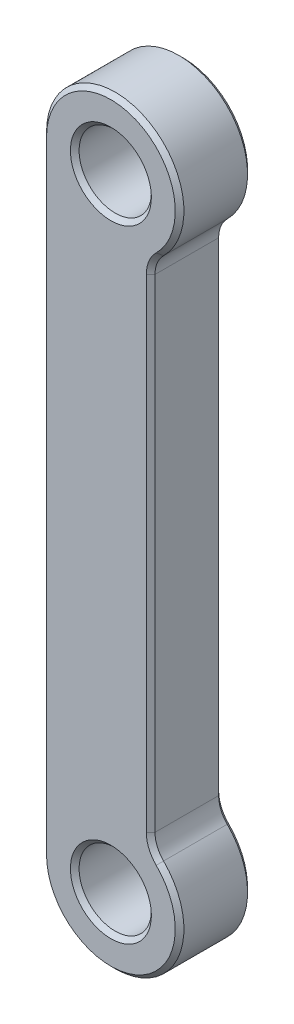
ISO-10303-21;
HEADER;
FILE_DESCRIPTION(('STEP AP214'),'2;1');
FILE_NAME('part.step','',(''),(''),'','','');
FILE_SCHEMA(('AUTOMOTIVE_DESIGN { 1 0 10303 214 1 1 1 1 }'));
ENDSEC;
DATA;
#1=APPLICATION_CONTEXT('core data for automotive mechanical design processes');
#2=APPLICATION_PROTOCOL_DEFINITION('international standard','automotive_design',2000,#1);
#3=PRODUCT_CONTEXT('',#1,'mechanical');
#4=PRODUCT('Part','Part','',(#3));
#5=PRODUCT_RELATED_PRODUCT_CATEGORY('part','',(#4));
#6=PRODUCT_DEFINITION_FORMATION('','',#4);
#7=PRODUCT_DEFINITION_CONTEXT('part definition',#1,'design');
#8=PRODUCT_DEFINITION('design','',#6,#7);
#9=PRODUCT_DEFINITION_SHAPE('','',#8);
#10=(LENGTH_UNIT() NAMED_UNIT(*) SI_UNIT(.MILLI.,.METRE.));
#11=(NAMED_UNIT(*) PLANE_ANGLE_UNIT() SI_UNIT($,.RADIAN.));
#12=(NAMED_UNIT(*) SI_UNIT($,.STERADIAN.) SOLID_ANGLE_UNIT());
#13=UNCERTAINTY_MEASURE_WITH_UNIT(LENGTH_MEASURE(1.E-05),#10,'distance_accuracy_value','');
#14=(GEOMETRIC_REPRESENTATION_CONTEXT(3) GLOBAL_UNCERTAINTY_ASSIGNED_CONTEXT((#13)) GLOBAL_UNIT_ASSIGNED_CONTEXT((#10,
#11,#12)) REPRESENTATION_CONTEXT('',''));
#15=CARTESIAN_POINT('',(0.,0.,0.));
#16=DIRECTION('',(0.,0.,1.));
#17=DIRECTION('',(1.,0.,0.));
#18=AXIS2_PLACEMENT_3D('',#15,#16,#17);
#19=CARTESIAN_POINT('',(5.75000000000001,-16.7041684766873,5.0000000000523));
#20=DIRECTION('',(0.,0.,1.));
#21=DIRECTION('',(1.,0.,0.));
#22=AXIS2_PLACEMENT_3D('',#19,#20,#21);
#23=CONICAL_SURFACE('',#22,2.29999999996879,0.785398163397448);
#24=CARTESIAN_POINT('',(5.75000000000001,-16.7041684766873,4.70000000001392));
#25=DIRECTION('',(0.,0.,1.));
#26=DIRECTION('',(1.,0.,0.));
#27=AXIS2_PLACEMENT_3D('',#24,#25,#26);
#28=CIRCLE('',#27,1.99999999993041);
#29=CARTESIAN_POINT('',(3.75000000003787,-16.7041684766873,4.70000000000696));
#30=VERTEX_POINT('',#29);
#31=CARTESIAN_POINT('',(4.34259259260149,-18.1251555946751,4.70000000002117));
#32=VERTEX_POINT('',#31);
#33=EDGE_CURVE('E87',#30,#32,#28,.T.);
#34=ORIENTED_EDGE('',*,*,#33,.F.);
#35=DIRECTION('',(0.707106781186557,0.,-0.707106781186538));
#36=VECTOR('',#35,1.);
#37=CARTESIAN_POINT('',(-498988.5,-16.7041684766262,498996.949999987));
#38=LINE('',#37,#36);
#39=CARTESIAN_POINT('',(3.45000000001533,-16.7041684766873,5.00000000005343));
#40=VERTEX_POINT('',#39);
#41=EDGE_CURVE('E92',#40,#30,#38,.T.);
#42=ORIENTED_EDGE('',*,*,#41,.F.);
#43=CARTESIAN_POINT('',(5.75000000000001,-16.7041684766873,5.0000000000523));
#44=DIRECTION('',(0.,0.,1.));
#45=DIRECTION('',(1.,0.,0.));
#46=AXIS2_PLACEMENT_3D('',#43,#44,#45);
#47=CIRCLE('',#46,2.29999999996879);
#48=CARTESIAN_POINT('',(4.13148148149628,-18.338303662365,5.0000000000523));
#49=VERTEX_POINT('',#48);
#50=EDGE_CURVE('E19',#49,#40,#47,.F.);
#51=ORIENTED_EDGE('',*,*,#50,.F.);
#52=DIRECTION('',(0.497593660834985,0.502394813564841,-0.707106781186538));
#53=VECTOR('',#52,1.);
#54=CARTESIAN_POINT('',(-351138.351851852,-354548.904776148,498996.949999987));
#55=LINE('',#54,#53);
#56=EDGE_CURVE('E73',#32,#49,#55,.F.);
#57=ORIENTED_EDGE('',*,*,#56,.F.);
#58=EDGE_LOOP('',(#34,#42,#51,#57));
#59=FACE_BOUND('',#58,.T.);
#60=ADVANCED_FACE('F16',(#59),#23,.F.);
#61=CARTESIAN_POINT('',(5.75000000000001,16.7041684766873,4.99999999999545));
#62=DIRECTION('',(0.,0.,1.));
#63=DIRECTION('',(1.,0.,0.));
#64=AXIS2_PLACEMENT_3D('',#61,#62,#63);
#65=CONICAL_SURFACE('',#64,2.30000000008249,0.785398163397448);
#66=CARTESIAN_POINT('',(5.75000000000001,16.7041684766873,4.99999999999545));
#67=DIRECTION('',(0.,0.,1.));
#68=DIRECTION('',(1.,0.,0.));
#69=AXIS2_PLACEMENT_3D('',#66,#67,#68);
#70=CIRCLE('',#69,2.30000000008249);
#71=CARTESIAN_POINT('',(3.44999999996824,16.7041684766873,5.00000000002501));
#72=VERTEX_POINT('',#71);
#73=CARTESIAN_POINT('',(4.13148148145628,18.3383036624623,4.99999999999545));
#74=VERTEX_POINT('',#73);
#75=EDGE_CURVE('E96',#72,#74,#70,.F.);
#76=ORIENTED_EDGE('',*,*,#75,.F.);
#77=DIRECTION('',(0.707106781186557,0.,-0.707106781186538));
#78=VECTOR('',#77,1.);
#79=CARTESIAN_POINT('',(-498988.5,16.7041684767484,498996.949999986));
#80=LINE('',#79,#78);
#81=CARTESIAN_POINT('',(3.74999999996681,16.7041684766873,4.69999999999275));
#82=VERTEX_POINT('',#81);
#83=EDGE_CURVE('E147',#82,#72,#80,.F.);
#84=ORIENTED_EDGE('',*,*,#83,.F.);
#85=CARTESIAN_POINT('',(5.75000000000001,16.7041684766873,4.69999999995707));
#86=DIRECTION('',(0.,0.,1.));
#87=DIRECTION('',(1.,0.,0.));
#88=AXIS2_PLACEMENT_3D('',#85,#86,#87);
#89=CIRCLE('',#88,2.0000000000441);
#90=CARTESIAN_POINT('',(4.34259259258853,18.1251555947165,4.69999999997854));
#91=VERTEX_POINT('',#90);
#92=EDGE_CURVE('E86',#91,#82,#89,.T.);
#93=ORIENTED_EDGE('',*,*,#92,.F.);
#94=DIRECTION('',(0.497593660834985,-0.502394813564841,-0.707106781186538));
#95=VECTOR('',#94,1.);
#96=CARTESIAN_POINT('',(-351138.351851852,354548.904776149,498996.949999986));
#97=LINE('',#96,#95);
#98=EDGE_CURVE('E97',#74,#91,#97,.T.);
#99=ORIENTED_EDGE('',*,*,#98,.F.);
#100=EDGE_LOOP('',(#76,#84,#93,#99));
#101=FACE_BOUND('',#100,.T.);
#102=ADVANCED_FACE('F351',(#101),#65,.F.);
#103=CARTESIAN_POINT('',(0.999999999999995,21.5,5.));
#104=DIRECTION('',(0.,0.,1.));
#105=DIRECTION('',(1.,0.,0.));
#106=AXIS2_PLACEMENT_3D('',#103,#104,#105);
#107=PLANE('',#106);
#108=CARTESIAN_POINT('',(1.,-21.5,5.00000000010914));
#109=DIRECTION('',(0.,0.,1.));
#110=DIRECTION('',(1.,0.,0.));
#111=AXIS2_PLACEMENT_3D('',#108,#109,#110);
#112=CIRCLE('',#111,2.79999999995562);
#113=CARTESIAN_POINT('',(3.79999999995562,-21.5,5.00000000010914));
#114=VERTEX_POINT('',#113);
#115=EDGE_CURVE('E109',#114,#114,#112,.F.);
#116=ORIENTED_EDGE('',*,*,#115,.T.);
#117=EDGE_LOOP('',(#116));
#118=FACE_BOUND('',#117,.T.);
#119=CARTESIAN_POINT('',(0.999999999999995,21.5,5.00000000010914));
#120=DIRECTION('',(0.,0.,1.));
#121=DIRECTION('',(1.,0.,0.));
#122=AXIS2_PLACEMENT_3D('',#119,#120,#121);
#123=CIRCLE('',#122,2.79999999995562);
#124=CARTESIAN_POINT('',(3.79999999995562,21.5,5.00000000010914));
#125=VERTEX_POINT('',#124);
#126=EDGE_CURVE('E115',#125,#125,#123,.F.);
#127=ORIENTED_EDGE('',*,*,#126,.T.);
#128=EDGE_LOOP('',(#127));
#129=FACE_BOUND('',#128,.T.);
#130=CARTESIAN_POINT('',(0.999999999999995,21.5,4.99999999999545));
#131=DIRECTION('',(0.,0.,-1.));
#132=DIRECTION('',(-1.,0.,0.));
#133=AXIS2_PLACEMENT_3D('',#130,#131,#132);
#134=CIRCLE('',#133,4.45000000004347);
#135=CARTESIAN_POINT('',(-3.45000000000227,21.5,4.99999999999773));
#136=VERTEX_POINT('',#135);
#137=EDGE_CURVE('E111',#136,#74,#134,.T.);
#138=ORIENTED_EDGE('',*,*,#137,.F.);
#139=DIRECTION('',(0.,1.,0.));
#140=VECTOR('',#139,1.);
#141=CARTESIAN_POINT('',(-3.45,21.5,5.));
#142=LINE('',#141,#140);
#143=CARTESIAN_POINT('',(-3.44999999995307,-21.5,5.0000000000523));
#144=VERTEX_POINT('',#143);
#145=EDGE_CURVE('E100',#144,#136,#142,.T.);
#146=ORIENTED_EDGE('',*,*,#145,.F.);
#147=CARTESIAN_POINT('',(1.,-21.5,5.0000000000523));
#148=DIRECTION('',(0.,0.,-1.));
#149=DIRECTION('',(-1.,0.,0.));
#150=AXIS2_PLACEMENT_3D('',#147,#148,#149);
#151=CIRCLE('',#150,4.44999999992979);
#152=EDGE_CURVE('E78',#49,#144,#151,.T.);
#153=ORIENTED_EDGE('',*,*,#152,.F.);
#154=ORIENTED_EDGE('',*,*,#50,.T.);
#155=DIRECTION('',(0.,1.,0.));
#156=VECTOR('',#155,1.);
#157=CARTESIAN_POINT('',(3.45,21.5,5.));
#158=LINE('',#157,#156);
#159=EDGE_CURVE('E101',#72,#40,#158,.F.);
#160=ORIENTED_EDGE('',*,*,#159,.F.);
#161=ORIENTED_EDGE('',*,*,#75,.T.);
#162=EDGE_LOOP('',(#138,#146,#153,#154,#160,#161));
#163=FACE_BOUND('',#162,.T.);
#164=ADVANCED_FACE('F98',(#118,#129,#163),#107,.T.);
#165=CARTESIAN_POINT('',(0.999999999999995,21.5,5.00000000010914));
#166=DIRECTION('',(0.,0.,1.));
#167=DIRECTION('',(1.,0.,0.));
#168=AXIS2_PLACEMENT_3D('',#165,#166,#167);
#169=CONICAL_SURFACE('',#168,2.79999999995562,0.785398163397448);
#170=ORIENTED_EDGE('',*,*,#126,.F.);
#171=EDGE_LOOP('',(#170));
#172=FACE_BOUND('',#171,.T.);
#173=CARTESIAN_POINT('',(0.999999999999995,21.5,4.7));
#174=DIRECTION('',(0.,0.,-1.));
#175=DIRECTION('',(-1.,0.,0.));
#176=AXIS2_PLACEMENT_3D('',#173,#174,#175);
#177=CIRCLE('',#176,2.5);
#178=CARTESIAN_POINT('',(-1.50000000000001,21.5,4.7));
#179=VERTEX_POINT('',#178);
#180=EDGE_CURVE('E143',#179,#179,#177,.T.);
#181=ORIENTED_EDGE('',*,*,#180,.T.);
#182=EDGE_LOOP('',(#181));
#183=FACE_BOUND('',#182,.T.);
#184=ADVANCED_FACE('F358',(#172,#183),#169,.F.);
#185=CARTESIAN_POINT('',(0.999999999999995,21.5,4.70000000001392));
#186=DIRECTION('',(0.,0.,-1.));
#187=DIRECTION('',(-1.,0.,0.));
#188=AXIS2_PLACEMENT_3D('',#185,#186,#187);
#189=CONICAL_SURFACE('',#188,4.74999999996816,0.785398163302709);
#190=DIRECTION('',(0.707106781186557,0.,0.707106781186538));
#191=VECTOR('',#190,1.);
#192=CARTESIAN_POINT('',(-3.45,21.5,5.));
#193=LINE('',#192,#191);
#194=CARTESIAN_POINT('',(-3.75,21.5,4.7));
#195=VERTEX_POINT('',#194);
#196=EDGE_CURVE('E114',#136,#195,#193,.F.);
#197=ORIENTED_EDGE('',*,*,#196,.F.);
#198=ORIENTED_EDGE('',*,*,#137,.T.);
#199=ORIENTED_EDGE('',*,*,#98,.T.);
#200=CARTESIAN_POINT('',(0.999999999999995,21.5,4.7));
#201=DIRECTION('',(0.,0.,-1.));
#202=DIRECTION('',(-1.,0.,0.));
#203=AXIS2_PLACEMENT_3D('',#200,#201,#202);
#204=CIRCLE('',#203,4.75);
#205=EDGE_CURVE('E130',#195,#91,#204,.T.);
#206=ORIENTED_EDGE('',*,*,#205,.F.);
#207=EDGE_LOOP('',(#197,#198,#199,#206));
#208=FACE_BOUND('',#207,.T.);
#209=ADVANCED_FACE('F124',(#208),#189,.T.);
#210=CARTESIAN_POINT('',(-3.45,21.5,5.));
#211=DIRECTION('',(-0.707106781186538,0.,0.707106781186557));
#212=DIRECTION('',(0.707106781186557,0.,0.707106781186538));
#213=AXIS2_PLACEMENT_3D('',#210,#211,#212);
#214=PLANE('',#213);
#215=DIRECTION('',(0.707106781186557,0.,0.707106781186538));
#216=VECTOR('',#215,1.);
#217=CARTESIAN_POINT('',(-499000.,-21.5,-498991.549999987));
#218=LINE('',#217,#216);
#219=CARTESIAN_POINT('',(-3.74999999997783,-21.5,4.70000000001769));
#220=VERTEX_POINT('',#219);
#221=EDGE_CURVE('E102',#144,#220,#218,.F.);
#222=ORIENTED_EDGE('',*,*,#221,.F.);
#223=ORIENTED_EDGE('',*,*,#145,.T.);
#224=ORIENTED_EDGE('',*,*,#196,.T.);
#225=DIRECTION('',(0.,1.,0.));
#226=VECTOR('',#225,1.);
#227=CARTESIAN_POINT('',(-3.75,21.5,4.7));
#228=LINE('',#227,#226);
#229=EDGE_CURVE('E240',#195,#220,#228,.F.);
#230=ORIENTED_EDGE('',*,*,#229,.T.);
#231=EDGE_LOOP('',(#222,#223,#224,#230));
#232=FACE_BOUND('',#231,.T.);
#233=ADVANCED_FACE('F419',(#232),#214,.T.);
#234=CARTESIAN_POINT('',(1.,-21.5,4.70000000007076));
#235=DIRECTION('',(0.,0.,-1.));
#236=DIRECTION('',(-1.,0.,0.));
#237=AXIS2_PLACEMENT_3D('',#234,#235,#236);
#238=CONICAL_SURFACE('',#237,4.74999999991132,0.785398163397448);
#239=ORIENTED_EDGE('',*,*,#56,.T.);
#240=ORIENTED_EDGE('',*,*,#152,.T.);
#241=ORIENTED_EDGE('',*,*,#221,.T.);
#242=CARTESIAN_POINT('',(1.,-21.5,4.7));
#243=DIRECTION('',(0.,0.,-1.));
#244=DIRECTION('',(-1.,0.,0.));
#245=AXIS2_PLACEMENT_3D('',#242,#243,#244);
#246=CIRCLE('',#245,4.75);
#247=EDGE_CURVE('E82',#32,#220,#246,.T.);
#248=ORIENTED_EDGE('',*,*,#247,.F.);
#249=EDGE_LOOP('',(#239,#240,#241,#248));
#250=FACE_BOUND('',#249,.T.);
#251=ADVANCED_FACE('F75',(#250),#238,.T.);
#252=CARTESIAN_POINT('',(3.45,21.5,5.));
#253=DIRECTION('',(0.707106781186538,0.,0.707106781186557));
#254=DIRECTION('',(0.707106781186557,0.,-0.707106781186538));
#255=AXIS2_PLACEMENT_3D('',#252,#253,#254);
#256=PLANE('',#255);
#257=ORIENTED_EDGE('',*,*,#41,.T.);
#258=DIRECTION('',(0.,-1.,0.));
#259=VECTOR('',#258,1.);
#260=CARTESIAN_POINT('',(3.75000000000001,16.7041684766873,4.7));
#261=LINE('',#260,#259);
#262=EDGE_CURVE('E208',#30,#82,#261,.F.);
#263=ORIENTED_EDGE('',*,*,#262,.T.);
#264=ORIENTED_EDGE('',*,*,#83,.T.);
#265=ORIENTED_EDGE('',*,*,#159,.T.);
#266=EDGE_LOOP('',(#257,#263,#264,#265));
#267=FACE_BOUND('',#266,.T.);
#268=ADVANCED_FACE('F350',(#267),#256,.T.);
#269=CARTESIAN_POINT('',(5.75000000000001,16.7041684766873,5.));
#270=DIRECTION('',(0.,0.,-1.));
#271=DIRECTION('',(-1.,0.,0.));
#272=AXIS2_PLACEMENT_3D('',#269,#270,#271);
#273=CYLINDRICAL_SURFACE('',#272,2.);
#274=CARTESIAN_POINT('',(5.75000000000001,16.7041684766873,0.300000000000002));
#275=DIRECTION('',(0.,0.,-1.));
#276=DIRECTION('',(-1.,0.,0.));
#277=AXIS2_PLACEMENT_3D('',#274,#275,#276);
#278=CIRCLE('',#277,2.);
#279=CARTESIAN_POINT('',(4.34259259257847,18.1251555947189,0.299999999976559));
#280=VERTEX_POINT('',#279);
#281=CARTESIAN_POINT('',(3.75000000000626,16.7041684766873,0.299999999981175));
#282=VERTEX_POINT('',#281);
#283=EDGE_CURVE('E104',#280,#282,#278,.F.);
#284=ORIENTED_EDGE('',*,*,#283,.F.);
#285=DIRECTION('',(0.,0.,-1.));
#286=VECTOR('',#285,1.);
#287=CARTESIAN_POINT('',(4.3425925925926,18.1251555947059,5.));
#288=LINE('',#287,#286);
#289=EDGE_CURVE('E145',#91,#280,#288,.T.);
#290=ORIENTED_EDGE('',*,*,#289,.F.);
#291=ORIENTED_EDGE('',*,*,#92,.T.);
#292=DIRECTION('',(0.,0.,1.));
#293=VECTOR('',#292,1.);
#294=CARTESIAN_POINT('',(3.75000000000001,16.7041684766873,5.));
#295=LINE('',#294,#293);
#296=EDGE_CURVE('E203',#82,#282,#295,.F.);
#297=ORIENTED_EDGE('',*,*,#296,.T.);
#298=EDGE_LOOP('',(#284,#290,#291,#297));
#299=FACE_BOUND('',#298,.T.);
#300=ADVANCED_FACE('F411',(#299),#273,.F.);
#301=CARTESIAN_POINT('',(5.75000000000001,-16.7041684766873,5.));
#302=DIRECTION('',(0.,0.,-1.));
#303=DIRECTION('',(-1.,0.,0.));
#304=AXIS2_PLACEMENT_3D('',#301,#302,#303);
#305=CYLINDRICAL_SURFACE('',#304,2.);
#306=CARTESIAN_POINT('',(5.75000000000001,-16.7041684766873,0.300000000000002));
#307=DIRECTION('',(0.,0.,-1.));
#308=DIRECTION('',(-1.,0.,0.));
#309=AXIS2_PLACEMENT_3D('',#306,#307,#308);
#310=CIRCLE('',#309,2.);
#311=CARTESIAN_POINT('',(3.75000000000001,-16.7041684766873,0.300000000000002));
#312=VERTEX_POINT('',#311);
#313=CARTESIAN_POINT('',(4.34259259258328,-18.1251555947461,0.299999999976559));
#314=VERTEX_POINT('',#313);
#315=EDGE_CURVE('E251',#312,#314,#310,.F.);
#316=ORIENTED_EDGE('',*,*,#315,.F.);
#317=DIRECTION('',(0.,0.,1.));
#318=VECTOR('',#317,1.);
#319=CARTESIAN_POINT('',(3.75000000000001,-16.7041684766873,5.));
#320=LINE('',#319,#318);
#321=EDGE_CURVE('E199',#312,#30,#320,.T.);
#322=ORIENTED_EDGE('',*,*,#321,.T.);
#323=ORIENTED_EDGE('',*,*,#33,.T.);
#324=DIRECTION('',(0.,0.,-1.));
#325=VECTOR('',#324,1.);
#326=CARTESIAN_POINT('',(4.3425925925926,-18.1251555947059,5.));
#327=LINE('',#326,#325);
#328=EDGE_CURVE('E217',#314,#32,#327,.F.);
#329=ORIENTED_EDGE('',*,*,#328,.F.);
#330=EDGE_LOOP('',(#316,#322,#323,#329));
#331=FACE_BOUND('',#330,.T.);
#332=ADVANCED_FACE('F344',(#331),#305,.F.);
#333=CARTESIAN_POINT('',(1.,-21.5,5.00000000010914));
#334=DIRECTION('',(0.,0.,1.));
#335=DIRECTION('',(1.,0.,0.));
#336=AXIS2_PLACEMENT_3D('',#333,#334,#335);
#337=CONICAL_SURFACE('',#336,2.79999999995562,0.785398163397448);
#338=ORIENTED_EDGE('',*,*,#115,.F.);
#339=EDGE_LOOP('',(#338));
#340=FACE_BOUND('',#339,.T.);
#341=CARTESIAN_POINT('',(1.,-21.5,4.7));
#342=DIRECTION('',(0.,0.,-1.));
#343=DIRECTION('',(-1.,0.,0.));
#344=AXIS2_PLACEMENT_3D('',#341,#342,#343);
#345=CIRCLE('',#344,2.5);
#346=CARTESIAN_POINT('',(-1.5,-21.5,4.7));
#347=VERTEX_POINT('',#346);
#348=EDGE_CURVE('E202',#347,#347,#345,.T.);
#349=ORIENTED_EDGE('',*,*,#348,.T.);
#350=EDGE_LOOP('',(#349));
#351=FACE_BOUND('',#350,.T.);
#352=ADVANCED_FACE('F404',(#340,#351),#337,.F.);
#353=CARTESIAN_POINT('',(0.999999999999995,21.5,5.));
#354=DIRECTION('',(0.,0.,-1.));
#355=DIRECTION('',(-1.,0.,0.));
#356=AXIS2_PLACEMENT_3D('',#353,#354,#355);
#357=CYLINDRICAL_SURFACE('',#356,2.5);
#358=CARTESIAN_POINT('',(0.999999999999995,21.5,0.299999999981537));
#359=DIRECTION('',(0.,0.,-1.));
#360=DIRECTION('',(-1.,0.,0.));
#361=AXIS2_PLACEMENT_3D('',#358,#359,#360);
#362=CIRCLE('',#361,2.50000000002137);
#363=CARTESIAN_POINT('',(-1.50000000002137,21.5,0.299999999981537));
#364=VERTEX_POINT('',#363);
#365=EDGE_CURVE('E236',#364,#364,#362,.T.);
#366=ORIENTED_EDGE('',*,*,#365,.T.);
#367=EDGE_LOOP('',(#366));
#368=FACE_BOUND('',#367,.T.);
#369=ORIENTED_EDGE('',*,*,#180,.F.);
#370=EDGE_LOOP('',(#369));
#371=FACE_BOUND('',#370,.T.);
#372=ADVANCED_FACE('F401',(#368,#371),#357,.F.);
#373=CARTESIAN_POINT('',(0.999999999999995,21.5,5.));
#374=DIRECTION('',(0.,0.,-1.));
#375=DIRECTION('',(-1.,0.,0.));
#376=AXIS2_PLACEMENT_3D('',#373,#374,#375);
#377=CYLINDRICAL_SURFACE('',#376,4.75);
#378=DIRECTION('',(0.,0.,-1.));
#379=VECTOR('',#378,1.);
#380=CARTESIAN_POINT('',(-3.75,21.5,5.));
#381=LINE('',#380,#379);
#382=CARTESIAN_POINT('',(-3.74999999998022,21.5,0.299999999995386));
#383=VERTEX_POINT('',#382);
#384=EDGE_CURVE('E231',#383,#195,#381,.F.);
#385=ORIENTED_EDGE('',*,*,#384,.T.);
#386=ORIENTED_EDGE('',*,*,#205,.T.);
#387=ORIENTED_EDGE('',*,*,#289,.T.);
#388=CARTESIAN_POINT('',(0.999999999999995,21.5,0.299999999981537));
#389=DIRECTION('',(0.,0.,1.));
#390=DIRECTION('',(1.,0.,0.));
#391=AXIS2_PLACEMENT_3D('',#388,#389,#390);
#392=CIRCLE('',#391,4.74999999992088);
#393=EDGE_CURVE('E226',#383,#280,#392,.F.);
#394=ORIENTED_EDGE('',*,*,#393,.F.);
#395=EDGE_LOOP('',(#385,#386,#387,#394));
#396=FACE_BOUND('',#395,.T.);
#397=ADVANCED_FACE('F271',(#396),#377,.T.);
#398=CARTESIAN_POINT('',(-3.75,21.5,5.));
#399=DIRECTION('',(1.,0.,0.));
#400=DIRECTION('',(0.,0.,-1.));
#401=AXIS2_PLACEMENT_3D('',#398,#399,#400);
#402=PLANE('',#401);
#403=DIRECTION('',(0.,1.,0.));
#404=VECTOR('',#403,1.);
#405=CARTESIAN_POINT('',(-3.75,21.5,0.300000000000002));
#406=LINE('',#405,#404);
#407=CARTESIAN_POINT('',(-3.74999999997226,-21.5,0.299999999962348));
#408=VERTEX_POINT('',#407);
#409=EDGE_CURVE('E222',#383,#408,#406,.F.);
#410=ORIENTED_EDGE('',*,*,#409,.T.);
#411=DIRECTION('',(0.,0.,-1.));
#412=VECTOR('',#411,1.);
#413=CARTESIAN_POINT('',(-3.75,-21.5,5.));
#414=LINE('',#413,#412);
#415=EDGE_CURVE('E219',#220,#408,#414,.T.);
#416=ORIENTED_EDGE('',*,*,#415,.F.);
#417=ORIENTED_EDGE('',*,*,#229,.F.);
#418=ORIENTED_EDGE('',*,*,#384,.F.);
#419=EDGE_LOOP('',(#410,#416,#417,#418));
#420=FACE_BOUND('',#419,.T.);
#421=ADVANCED_FACE('F306',(#420),#402,.F.);
#422=CARTESIAN_POINT('',(1.,-21.5,5.));
#423=DIRECTION('',(0.,0.,-1.));
#424=DIRECTION('',(-1.,0.,0.));
#425=AXIS2_PLACEMENT_3D('',#422,#423,#424);
#426=CYLINDRICAL_SURFACE('',#425,4.75);
#427=ORIENTED_EDGE('',*,*,#328,.T.);
#428=ORIENTED_EDGE('',*,*,#247,.T.);
#429=ORIENTED_EDGE('',*,*,#415,.T.);
#430=CARTESIAN_POINT('',(1.,-21.5,0.299999999981537));
#431=DIRECTION('',(0.,0.,1.));
#432=DIRECTION('',(1.,0.,0.));
#433=AXIS2_PLACEMENT_3D('',#430,#431,#432);
#434=CIRCLE('',#433,4.74999999997772);
#435=EDGE_CURVE('E211',#314,#408,#434,.F.);
#436=ORIENTED_EDGE('',*,*,#435,.F.);
#437=EDGE_LOOP('',(#427,#428,#429,#436));
#438=FACE_BOUND('',#437,.T.);
#439=ADVANCED_FACE('F303',(#438),#426,.T.);
#440=CARTESIAN_POINT('',(3.75000000000001,16.7041684766873,5.));
#441=DIRECTION('',(-1.,0.,0.));
#442=DIRECTION('',(0.,-1.,0.));
#443=AXIS2_PLACEMENT_3D('',#440,#441,#442);
#444=PLANE('',#443);
#445=DIRECTION('',(0.,1.,0.));
#446=VECTOR('',#445,1.);
#447=CARTESIAN_POINT('',(3.75000000000001,16.7041684766873,0.300000000000004));
#448=LINE('',#447,#446);
#449=EDGE_CURVE('E192',#312,#282,#448,.T.);
#450=ORIENTED_EDGE('',*,*,#449,.T.);
#451=ORIENTED_EDGE('',*,*,#296,.F.);
#452=ORIENTED_EDGE('',*,*,#262,.F.);
#453=ORIENTED_EDGE('',*,*,#321,.F.);
#454=EDGE_LOOP('',(#450,#451,#452,#453));
#455=FACE_BOUND('',#454,.T.);
#456=ADVANCED_FACE('F348',(#455),#444,.F.);
#457=CARTESIAN_POINT('',(1.,-21.5,5.));
#458=DIRECTION('',(0.,0.,-1.));
#459=DIRECTION('',(-1.,0.,0.));
#460=AXIS2_PLACEMENT_3D('',#457,#458,#459);
#461=CYLINDRICAL_SURFACE('',#460,2.5);
#462=CARTESIAN_POINT('',(1.,-21.5,0.299999999981537));
#463=DIRECTION('',(0.,0.,-1.));
#464=DIRECTION('',(-1.,0.,0.));
#465=AXIS2_PLACEMENT_3D('',#462,#463,#464);
#466=CIRCLE('',#465,2.50000000002137);
#467=CARTESIAN_POINT('',(-1.50000000002137,-21.5,0.299999999981537));
#468=VERTEX_POINT('',#467);
#469=EDGE_CURVE('E178',#468,#468,#466,.T.);
#470=ORIENTED_EDGE('',*,*,#469,.T.);
#471=EDGE_LOOP('',(#470));
#472=FACE_BOUND('',#471,.T.);
#473=ORIENTED_EDGE('',*,*,#348,.F.);
#474=EDGE_LOOP('',(#473));
#475=FACE_BOUND('',#474,.T.);
#476=ADVANCED_FACE('F390',(#472,#475),#461,.F.);
#477=CARTESIAN_POINT('',(0.999999999999995,21.5,0.));
#478=DIRECTION('',(0.,0.,-1.));
#479=DIRECTION('',(-1.,0.,0.));
#480=AXIS2_PLACEMENT_3D('',#477,#478,#479);
#481=CONICAL_SURFACE('',#480,2.80000000000291,0.785398163397448);
#482=CARTESIAN_POINT('',(0.999999999999995,21.5,0.));
#483=DIRECTION('',(0.,0.,-1.));
#484=DIRECTION('',(-1.,0.,0.));
#485=AXIS2_PLACEMENT_3D('',#482,#483,#484);
#486=CIRCLE('',#485,2.80000000000291);
#487=CARTESIAN_POINT('',(-1.80000000000291,21.5,0.));
#488=VERTEX_POINT('',#487);
#489=EDGE_CURVE('E176',#488,#488,#486,.T.);
#490=ORIENTED_EDGE('',*,*,#489,.T.);
#491=EDGE_LOOP('',(#490));
#492=FACE_BOUND('',#491,.T.);
#493=ORIENTED_EDGE('',*,*,#365,.F.);
#494=EDGE_LOOP('',(#493));
#495=FACE_BOUND('',#494,.T.);
#496=ADVANCED_FACE('F386',(#492,#495),#481,.F.);
#497=CARTESIAN_POINT('',(0.999999999999995,21.5,0.299999999924694));
#498=DIRECTION('',(0.,0.,1.));
#499=DIRECTION('',(1.,0.,0.));
#500=AXIS2_PLACEMENT_3D('',#497,#498,#499);
#501=CONICAL_SURFACE('',#500,4.74999999986404,0.785398163397448);
#502=DIRECTION('',(0.707106781186548,0.,-0.707106781186548));
#503=VECTOR('',#502,1.);
#504=CARTESIAN_POINT('',(-3.75,21.5,0.300000000000002));
#505=LINE('',#504,#503);
#506=CARTESIAN_POINT('',(-3.45,21.5,0.));
#507=VERTEX_POINT('',#506);
#508=EDGE_CURVE('E225',#507,#383,#505,.F.);
#509=ORIENTED_EDGE('',*,*,#508,.T.);
#510=ORIENTED_EDGE('',*,*,#393,.T.);
#511=DIRECTION('',(0.497593660834978,-0.502394813564835,0.707106781186548));
#512=VECTOR('',#511,1.);
#513=CARTESIAN_POINT('',(-351144.016666666,354554.624249299,-499000.));
#514=LINE('',#513,#512);
#515=CARTESIAN_POINT('',(4.13148148149238,18.3383036624261,-4.71589845361186E-11));
#516=VERTEX_POINT('',#515);
#517=EDGE_CURVE('E182',#280,#516,#514,.F.);
#518=ORIENTED_EDGE('',*,*,#517,.T.);
#519=CARTESIAN_POINT('',(0.999999999999995,21.5,0.));
#520=DIRECTION('',(0.,0.,1.));
#521=DIRECTION('',(1.,0.,0.));
#522=AXIS2_PLACEMENT_3D('',#519,#520,#521);
#523=CIRCLE('',#522,4.44999999993934);
#524=EDGE_CURVE('E175',#516,#507,#523,.T.);
#525=ORIENTED_EDGE('',*,*,#524,.T.);
#526=EDGE_LOOP('',(#509,#510,#518,#525));
#527=FACE_BOUND('',#526,.T.);
#528=ADVANCED_FACE('F383',(#527),#501,.T.);
#529=CARTESIAN_POINT('',(-3.75,21.5,0.300000000000002));
#530=DIRECTION('',(0.707106781186548,0.,0.707106781186548));
#531=DIRECTION('',(0.707106781186548,0.,-0.707106781186548));
#532=AXIS2_PLACEMENT_3D('',#529,#530,#531);
#533=PLANE('',#532);
#534=DIRECTION('',(0.,1.,0.));
#535=VECTOR('',#534,1.);
#536=CARTESIAN_POINT('',(-3.45,21.5,0.));
#537=LINE('',#536,#535);
#538=CARTESIAN_POINT('',(-3.44999999999236,-21.5,-2.8421709430404E-11));
#539=VERTEX_POINT('',#538);
#540=EDGE_CURVE('E174',#507,#539,#537,.F.);
#541=ORIENTED_EDGE('',*,*,#540,.T.);
#542=DIRECTION('',(0.707106781186547,0.,-0.707106781186548));
#543=VECTOR('',#542,1.);
#544=CARTESIAN_POINT('',(-498998.,-21.4999999999389,498994.55));
#545=LINE('',#544,#543);
#546=EDGE_CURVE('E214',#408,#539,#545,.T.);
#547=ORIENTED_EDGE('',*,*,#546,.F.);
#548=ORIENTED_EDGE('',*,*,#409,.F.);
#549=ORIENTED_EDGE('',*,*,#508,.F.);
#550=EDGE_LOOP('',(#541,#547,#548,#549));
#551=FACE_BOUND('',#550,.T.);
#552=ADVANCED_FACE('F310',(#551),#533,.F.);
#553=CARTESIAN_POINT('',(1.,-21.5,0.29999999986785));
#554=DIRECTION('',(0.,0.,1.));
#555=DIRECTION('',(1.,0.,0.));
#556=AXIS2_PLACEMENT_3D('',#553,#554,#555);
#557=CONICAL_SURFACE('',#556,4.74999999992087,0.785398163397448);
#558=DIRECTION('',(0.497593660834979,0.502394813564833,0.707106781186549));
#559=VECTOR('',#558,1.);
#560=CARTESIAN_POINT('',(-351144.016666667,-354554.624249297,-499000.));
#561=LINE('',#560,#559);
#562=CARTESIAN_POINT('',(4.13148148151686,-18.3383036624348,-2.8421709430404E-11));
#563=VERTEX_POINT('',#562);
#564=EDGE_CURVE('E196',#563,#314,#561,.T.);
#565=ORIENTED_EDGE('',*,*,#564,.T.);
#566=ORIENTED_EDGE('',*,*,#435,.T.);
#567=ORIENTED_EDGE('',*,*,#546,.T.);
#568=CARTESIAN_POINT('',(1.,-21.5,0.));
#569=DIRECTION('',(0.,0.,1.));
#570=DIRECTION('',(1.,0.,0.));
#571=AXIS2_PLACEMENT_3D('',#568,#569,#570);
#572=CIRCLE('',#571,4.45000000005302);
#573=EDGE_CURVE('E172',#539,#563,#572,.T.);
#574=ORIENTED_EDGE('',*,*,#573,.T.);
#575=EDGE_LOOP('',(#565,#566,#567,#574));
#576=FACE_BOUND('',#575,.T.);
#577=ADVANCED_FACE('F297',(#576),#557,.T.);
#578=CARTESIAN_POINT('',(5.75000000000001,-16.7041684766873,-5.6843418860808E-11));
#579=DIRECTION('',(0.,0.,-1.));
#580=DIRECTION('',(-1.,0.,0.));
#581=AXIS2_PLACEMENT_3D('',#578,#579,#580);
#582=CONICAL_SURFACE('',#581,2.30000000001338,0.785398163397448);
#583=CARTESIAN_POINT('',(5.75000000000001,-16.7041684766873,-5.6843418860808E-11));
#584=DIRECTION('',(0.,0.,-1.));
#585=DIRECTION('',(-1.,0.,0.));
#586=AXIS2_PLACEMENT_3D('',#583,#584,#585);
#587=CIRCLE('',#586,2.30000000001338);
#588=CARTESIAN_POINT('',(3.44999999997159,-16.7041684766873,-2.84216145627139E-11));
#589=VERTEX_POINT('',#588);
#590=EDGE_CURVE('E169',#563,#589,#587,.T.);
#591=ORIENTED_EDGE('',*,*,#590,.T.);
#592=DIRECTION('',(0.707106781186547,0.,0.707106781186548));
#593=VECTOR('',#592,1.);
#594=CARTESIAN_POINT('',(3.75000000000001,-16.7041684766873,0.3));
#595=LINE('',#594,#593);
#596=EDGE_CURVE('E195',#589,#312,#595,.T.);
#597=ORIENTED_EDGE('',*,*,#596,.T.);
#598=ORIENTED_EDGE('',*,*,#315,.T.);
#599=ORIENTED_EDGE('',*,*,#564,.F.);
#600=EDGE_LOOP('',(#591,#597,#598,#599));
#601=FACE_BOUND('',#600,.T.);
#602=ADVANCED_FACE('F340',(#601),#582,.F.);
#603=CARTESIAN_POINT('',(3.75000000000001,16.7041684766873,0.300000000000002));
#604=DIRECTION('',(-0.707106781186548,0.,0.707106781186547));
#605=DIRECTION('',(0.707106781186547,0.,0.707106781186548));
#606=AXIS2_PLACEMENT_3D('',#603,#604,#605);
#607=PLANE('',#606);
#608=DIRECTION('',(0.,1.,0.));
#609=VECTOR('',#608,1.);
#610=CARTESIAN_POINT('',(3.45000000000001,21.5,0.));
#611=LINE('',#610,#609);
#612=CARTESIAN_POINT('',(3.45000000002954,16.7041684766873,-5.6843418860808E-11));
#613=VERTEX_POINT('',#612);
#614=EDGE_CURVE('E168',#589,#613,#611,.T.);
#615=ORIENTED_EDGE('',*,*,#614,.T.);
#616=DIRECTION('',(0.707106781186547,0.,0.707106781186548));
#617=VECTOR('',#616,1.);
#618=CARTESIAN_POINT('',(-498996.55,16.7041684766873,-499000.));
#619=LINE('',#618,#617);
#620=EDGE_CURVE('E34',#613,#282,#619,.T.);
#621=ORIENTED_EDGE('',*,*,#620,.T.);
#622=ORIENTED_EDGE('',*,*,#449,.F.);
#623=ORIENTED_EDGE('',*,*,#596,.F.);
#624=EDGE_LOOP('',(#615,#621,#622,#623));
#625=FACE_BOUND('',#624,.T.);
#626=ADVANCED_FACE('F333',(#625),#607,.F.);
#627=CARTESIAN_POINT('',(5.75000000000001,16.7041684766873,-5.6843418860808E-11));
#628=DIRECTION('',(0.,0.,-1.));
#629=DIRECTION('',(-1.,0.,0.));
#630=AXIS2_PLACEMENT_3D('',#627,#628,#629);
#631=CONICAL_SURFACE('',#630,2.29999999995653,0.785398163397448);
#632=ORIENTED_EDGE('',*,*,#283,.T.);
#633=ORIENTED_EDGE('',*,*,#620,.F.);
#634=CARTESIAN_POINT('',(5.75000000000001,16.7041684766873,-5.6843418860808E-11));
#635=DIRECTION('',(0.,0.,-1.));
#636=DIRECTION('',(-1.,0.,0.));
#637=AXIS2_PLACEMENT_3D('',#634,#635,#636);
#638=CIRCLE('',#637,2.29999999995653);
#639=EDGE_CURVE('E25',#613,#516,#638,.T.);
#640=ORIENTED_EDGE('',*,*,#639,.T.);
#641=ORIENTED_EDGE('',*,*,#517,.F.);
#642=EDGE_LOOP('',(#632,#633,#640,#641));
#643=FACE_BOUND('',#642,.T.);
#644=ADVANCED_FACE('F368',(#643),#631,.F.);
#645=CARTESIAN_POINT('',(1.,-21.5,0.));
#646=DIRECTION('',(0.,0.,-1.));
#647=DIRECTION('',(-1.,0.,0.));
#648=AXIS2_PLACEMENT_3D('',#645,#646,#647);
#649=CONICAL_SURFACE('',#648,2.80000000000291,0.785398163397448);
#650=CARTESIAN_POINT('',(1.,-21.5,0.));
#651=DIRECTION('',(0.,0.,-1.));
#652=DIRECTION('',(-1.,0.,0.));
#653=AXIS2_PLACEMENT_3D('',#650,#651,#652);
#654=CIRCLE('',#653,2.80000000000291);
#655=CARTESIAN_POINT('',(-1.80000000000291,-21.5,0.));
#656=VERTEX_POINT('',#655);
#657=EDGE_CURVE('E11',#656,#656,#654,.T.);
#658=ORIENTED_EDGE('',*,*,#657,.T.);
#659=EDGE_LOOP('',(#658));
#660=FACE_BOUND('',#659,.T.);
#661=ORIENTED_EDGE('',*,*,#469,.F.);
#662=EDGE_LOOP('',(#661));
#663=FACE_BOUND('',#662,.T.);
#664=ADVANCED_FACE('F362',(#660,#663),#649,.F.);
#665=CARTESIAN_POINT('',(0.999999999999995,21.5,0.));
#666=DIRECTION('',(0.,0.,1.));
#667=DIRECTION('',(1.,0.,0.));
#668=AXIS2_PLACEMENT_3D('',#665,#666,#667);
#669=PLANE('',#668);
#670=ORIENTED_EDGE('',*,*,#657,.F.);
#671=EDGE_LOOP('',(#670));
#672=FACE_BOUND('',#671,.T.);
#673=ORIENTED_EDGE('',*,*,#614,.F.);
#674=ORIENTED_EDGE('',*,*,#590,.F.);
#675=ORIENTED_EDGE('',*,*,#573,.F.);
#676=ORIENTED_EDGE('',*,*,#540,.F.);
#677=ORIENTED_EDGE('',*,*,#524,.F.);
#678=ORIENTED_EDGE('',*,*,#639,.F.);
#679=EDGE_LOOP('',(#673,#674,#675,#676,#677,#678));
#680=FACE_BOUND('',#679,.T.);
#681=ORIENTED_EDGE('',*,*,#489,.F.);
#682=EDGE_LOOP('',(#681));
#683=FACE_BOUND('',#682,.T.);
#684=ADVANCED_FACE('F337',(#672,#680,#683),#669,.F.);
#685=CLOSED_SHELL('',(#60,#102,#164,#184,#209,#233,#251,#268,#300,#332,#352,#372,#397,#421,#439,
#456,#476,#496,#528,#552,#577,#602,#626,#644,#664,#684));
#686=MANIFOLD_SOLID_BREP('B1',#685);
#687=ADVANCED_BREP_SHAPE_REPRESENTATION('',(#18,#686),#14);
#688=SHAPE_DEFINITION_REPRESENTATION(#9,#687);
ENDSEC;
END-ISO-10303-21;
